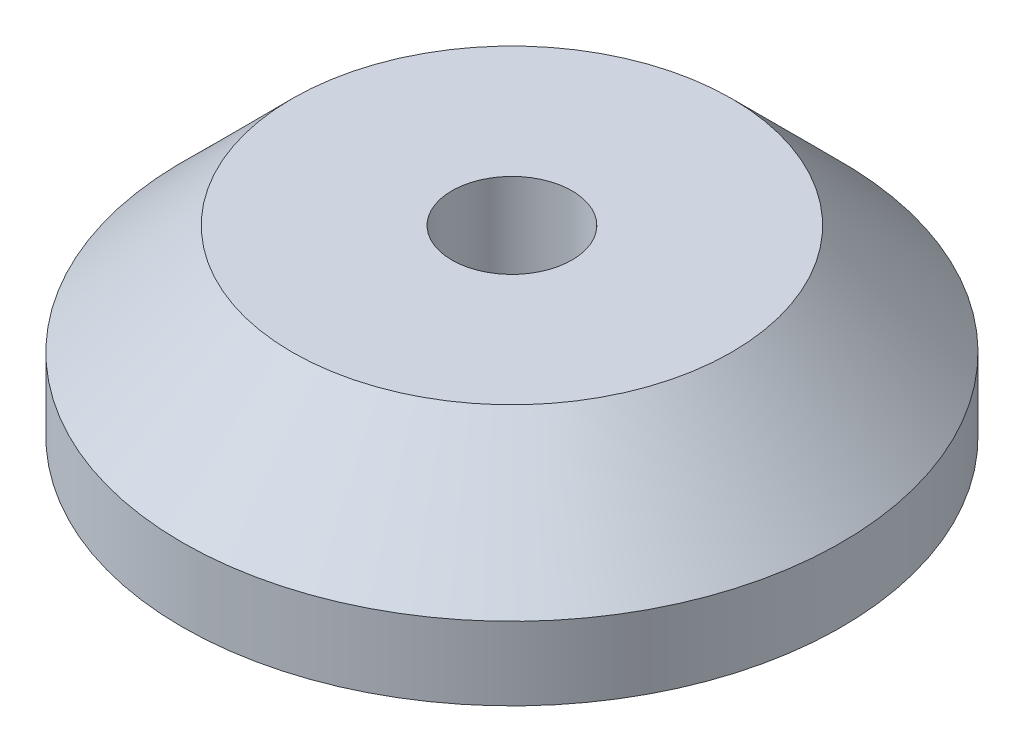
ISO-10303-21;
HEADER;
FILE_DESCRIPTION(('STEP AP214'),'2;1');
FILE_NAME('part.step','',(''),(''),'','','');
FILE_SCHEMA(('AUTOMOTIVE_DESIGN { 1 0 10303 214 1 1 1 1 }'));
ENDSEC;
DATA;
#1=APPLICATION_CONTEXT('core data for automotive mechanical design processes');
#2=APPLICATION_PROTOCOL_DEFINITION('international standard','automotive_design',2000,#1);
#3=PRODUCT_CONTEXT('',#1,'mechanical');
#4=PRODUCT('Part','Part','',(#3));
#5=PRODUCT_RELATED_PRODUCT_CATEGORY('part','',(#4));
#6=PRODUCT_DEFINITION_FORMATION('','',#4);
#7=PRODUCT_DEFINITION_CONTEXT('part definition',#1,'design');
#8=PRODUCT_DEFINITION('design','',#6,#7);
#9=PRODUCT_DEFINITION_SHAPE('','',#8);
#10=(LENGTH_UNIT() NAMED_UNIT(*) SI_UNIT(.MILLI.,.METRE.));
#11=(NAMED_UNIT(*) PLANE_ANGLE_UNIT() SI_UNIT($,.RADIAN.));
#12=(NAMED_UNIT(*) SI_UNIT($,.STERADIAN.) SOLID_ANGLE_UNIT());
#13=UNCERTAINTY_MEASURE_WITH_UNIT(LENGTH_MEASURE(1.E-05),#10,'distance_accuracy_value','');
#14=(GEOMETRIC_REPRESENTATION_CONTEXT(3) GLOBAL_UNCERTAINTY_ASSIGNED_CONTEXT((#13)) GLOBAL_UNIT_ASSIGNED_CONTEXT((#10,
#11,#12)) REPRESENTATION_CONTEXT('',''));
#15=CARTESIAN_POINT('',(0.,0.,0.));
#16=DIRECTION('',(0.,0.,1.));
#17=DIRECTION('',(1.,0.,0.));
#18=AXIS2_PLACEMENT_3D('',#15,#16,#17);
#19=CARTESIAN_POINT('',(0.,5.,0.));
#20=DIRECTION('',(0.,-1.,0.));
#21=DIRECTION('',(0.,0.,1.));
#22=AXIS2_PLACEMENT_3D('',#19,#20,#21);
#23=CONICAL_SURFACE('',#22,22.5,0.78539816339745);
#24=CARTESIAN_POINT('',(0.,12.5,0.));
#25=DIRECTION('',(0.,1.,0.));
#26=DIRECTION('',(0.,0.,1.));
#27=AXIS2_PLACEMENT_3D('',#24,#25,#26);
#28=CIRCLE('',#27,15.);
#29=CARTESIAN_POINT('',(0.,12.5,15.));
#30=VERTEX_POINT('',#29);
#31=EDGE_CURVE('E11',#30,#30,#28,.T.);
#32=ORIENTED_EDGE('',*,*,#31,.F.);
#33=EDGE_LOOP('',(#32));
#34=FACE_BOUND('',#33,.T.);
#35=CARTESIAN_POINT('',(0.,5.,0.));
#36=DIRECTION('',(0.,1.,0.));
#37=DIRECTION('',(0.,0.,1.));
#38=AXIS2_PLACEMENT_3D('',#35,#36,#37);
#39=CIRCLE('',#38,22.5);
#40=CARTESIAN_POINT('',(0.,5.,22.5));
#41=VERTEX_POINT('',#40);
#42=EDGE_CURVE('E46',#41,#41,#39,.T.);
#43=ORIENTED_EDGE('',*,*,#42,.T.);
#44=EDGE_LOOP('',(#43));
#45=FACE_BOUND('',#44,.T.);
#46=ADVANCED_FACE('F39',(#34,#45),#23,.T.);
#47=CARTESIAN_POINT('',(0.,12.5,0.));
#48=DIRECTION('',(0.,1.,0.));
#49=DIRECTION('',(0.,0.,1.));
#50=AXIS2_PLACEMENT_3D('',#47,#48,#49);
#51=PLANE('',#50);
#52=CARTESIAN_POINT('',(0.,12.5,0.));
#53=DIRECTION('',(0.,1.,0.));
#54=DIRECTION('',(0.,0.,1.));
#55=AXIS2_PLACEMENT_3D('',#52,#53,#54);
#56=CIRCLE('',#55,4.1);
#57=CARTESIAN_POINT('',(0.,12.5,4.1));
#58=VERTEX_POINT('',#57);
#59=EDGE_CURVE('E52',#58,#58,#56,.T.);
#60=ORIENTED_EDGE('',*,*,#59,.F.);
#61=EDGE_LOOP('',(#60));
#62=FACE_BOUND('',#61,.T.);
#63=ORIENTED_EDGE('',*,*,#31,.T.);
#64=EDGE_LOOP('',(#63));
#65=FACE_BOUND('',#64,.T.);
#66=ADVANCED_FACE('F68',(#62,#65),#51,.T.);
#67=CARTESIAN_POINT('',(0.,5.,0.));
#68=DIRECTION('',(0.,1.,0.));
#69=DIRECTION('',(0.,0.,1.));
#70=AXIS2_PLACEMENT_3D('',#67,#68,#69);
#71=PLANE('',#70);
#72=CARTESIAN_POINT('',(0.,5.,0.));
#73=DIRECTION('',(0.,1.,0.));
#74=DIRECTION('',(0.,0.,1.));
#75=AXIS2_PLACEMENT_3D('',#72,#73,#74);
#76=CIRCLE('',#75,4.1);
#77=CARTESIAN_POINT('',(0.,5.,4.1));
#78=VERTEX_POINT('',#77);
#79=EDGE_CURVE('E42',#78,#78,#76,.T.);
#80=ORIENTED_EDGE('',*,*,#79,.T.);
#81=EDGE_LOOP('',(#80));
#82=FACE_BOUND('',#81,.T.);
#83=ORIENTED_EDGE('',*,*,#42,.F.);
#84=EDGE_LOOP('',(#83));
#85=FACE_BOUND('',#84,.T.);
#86=ADVANCED_FACE('F59',(#82,#85),#71,.F.);
#87=CARTESIAN_POINT('',(0.,0.,0.));
#88=DIRECTION('',(0.,1.,0.));
#89=DIRECTION('',(0.,0.,1.));
#90=AXIS2_PLACEMENT_3D('',#87,#88,#89);
#91=CYLINDRICAL_SURFACE('',#90,4.1);
#92=ORIENTED_EDGE('',*,*,#59,.T.);
#93=EDGE_LOOP('',(#92));
#94=FACE_BOUND('',#93,.T.);
#95=ORIENTED_EDGE('',*,*,#79,.F.);
#96=EDGE_LOOP('',(#95));
#97=FACE_BOUND('',#96,.T.);
#98=ADVANCED_FACE('F62',(#94,#97),#91,.F.);
#99=CLOSED_SHELL('',(#46,#66,#86,#98));
#100=MANIFOLD_SOLID_BREP('B2',#99);
#101=CARTESIAN_POINT('',(0.,5.,0.));
#102=DIRECTION('',(0.,-1.,0.));
#103=DIRECTION('',(0.,0.,-1.));
#104=AXIS2_PLACEMENT_3D('',#101,#102,#103);
#105=CYLINDRICAL_SURFACE('',#104,22.5);
#106=CARTESIAN_POINT('',(0.,5.,0.));
#107=DIRECTION('',(0.,1.,0.));
#108=DIRECTION('',(0.,0.,1.));
#109=AXIS2_PLACEMENT_3D('',#106,#107,#108);
#110=CIRCLE('',#109,22.5);
#111=CARTESIAN_POINT('',(0.,5.,22.5));
#112=VERTEX_POINT('',#111);
#113=EDGE_CURVE('E38',#112,#112,#110,.T.);
#114=ORIENTED_EDGE('',*,*,#113,.F.);
#115=EDGE_LOOP('',(#114));
#116=FACE_BOUND('',#115,.T.);
#117=CARTESIAN_POINT('',(0.,0.,0.));
#118=DIRECTION('',(0.,1.,0.));
#119=DIRECTION('',(0.,0.,1.));
#120=AXIS2_PLACEMENT_3D('',#117,#118,#119);
#121=CIRCLE('',#120,22.5);
#122=CARTESIAN_POINT('',(0.,0.,22.5));
#123=VERTEX_POINT('',#122);
#124=EDGE_CURVE('E104',#123,#123,#121,.T.);
#125=ORIENTED_EDGE('',*,*,#124,.T.);
#126=EDGE_LOOP('',(#125));
#127=FACE_BOUND('',#126,.T.);
#128=ADVANCED_FACE('F101',(#116,#127),#105,.T.);
#129=CARTESIAN_POINT('',(0.,5.,0.));
#130=DIRECTION('',(0.,1.,0.));
#131=DIRECTION('',(0.,0.,1.));
#132=AXIS2_PLACEMENT_3D('',#129,#130,#131);
#133=PLANE('',#132);
#134=CARTESIAN_POINT('',(0.,5.,0.));
#135=DIRECTION('',(0.,1.,0.));
#136=DIRECTION('',(0.,0.,1.));
#137=AXIS2_PLACEMENT_3D('',#134,#135,#136);
#138=CIRCLE('',#137,4.1);
#139=CARTESIAN_POINT('',(0.,5.,4.1));
#140=VERTEX_POINT('',#139);
#141=EDGE_CURVE('E111',#140,#140,#138,.T.);
#142=ORIENTED_EDGE('',*,*,#141,.F.);
#143=EDGE_LOOP('',(#142));
#144=FACE_BOUND('',#143,.T.);
#145=ORIENTED_EDGE('',*,*,#113,.T.);
#146=EDGE_LOOP('',(#145));
#147=FACE_BOUND('',#146,.T.);
#148=ADVANCED_FACE('F129',(#144,#147),#133,.T.);
#149=CARTESIAN_POINT('',(0.,0.,0.));
#150=DIRECTION('',(0.,1.,0.));
#151=DIRECTION('',(0.,0.,1.));
#152=AXIS2_PLACEMENT_3D('',#149,#150,#151);
#153=PLANE('',#152);
#154=CARTESIAN_POINT('',(0.,0.,0.));
#155=DIRECTION('',(0.,1.,0.));
#156=DIRECTION('',(0.,0.,1.));
#157=AXIS2_PLACEMENT_3D('',#154,#155,#156);
#158=CIRCLE('',#157,4.1);
#159=CARTESIAN_POINT('',(0.,0.,4.1));
#160=VERTEX_POINT('',#159);
#161=EDGE_CURVE('E115',#160,#160,#158,.T.);
#162=ORIENTED_EDGE('',*,*,#161,.T.);
#163=EDGE_LOOP('',(#162));
#164=FACE_BOUND('',#163,.T.);
#165=ORIENTED_EDGE('',*,*,#124,.F.);
#166=EDGE_LOOP('',(#165));
#167=FACE_BOUND('',#166,.T.);
#168=ADVANCED_FACE('F119',(#164,#167),#153,.F.);
#169=CARTESIAN_POINT('',(0.,0.,0.));
#170=DIRECTION('',(0.,1.,0.));
#171=DIRECTION('',(0.,0.,1.));
#172=AXIS2_PLACEMENT_3D('',#169,#170,#171);
#173=CYLINDRICAL_SURFACE('',#172,4.1);
#174=ORIENTED_EDGE('',*,*,#141,.T.);
#175=EDGE_LOOP('',(#174));
#176=FACE_BOUND('',#175,.T.);
#177=ORIENTED_EDGE('',*,*,#161,.F.);
#178=EDGE_LOOP('',(#177));
#179=FACE_BOUND('',#178,.T.);
#180=ADVANCED_FACE('F122',(#176,#179),#173,.F.);
#181=CLOSED_SHELL('',(#128,#148,#168,#180));
#182=MANIFOLD_SOLID_BREP('B6',#181);
#183=ADVANCED_BREP_SHAPE_REPRESENTATION('',(#18,#100,#182),#14);
#184=SHAPE_DEFINITION_REPRESENTATION(#9,#183);
ENDSEC;
END-ISO-10303-21;
